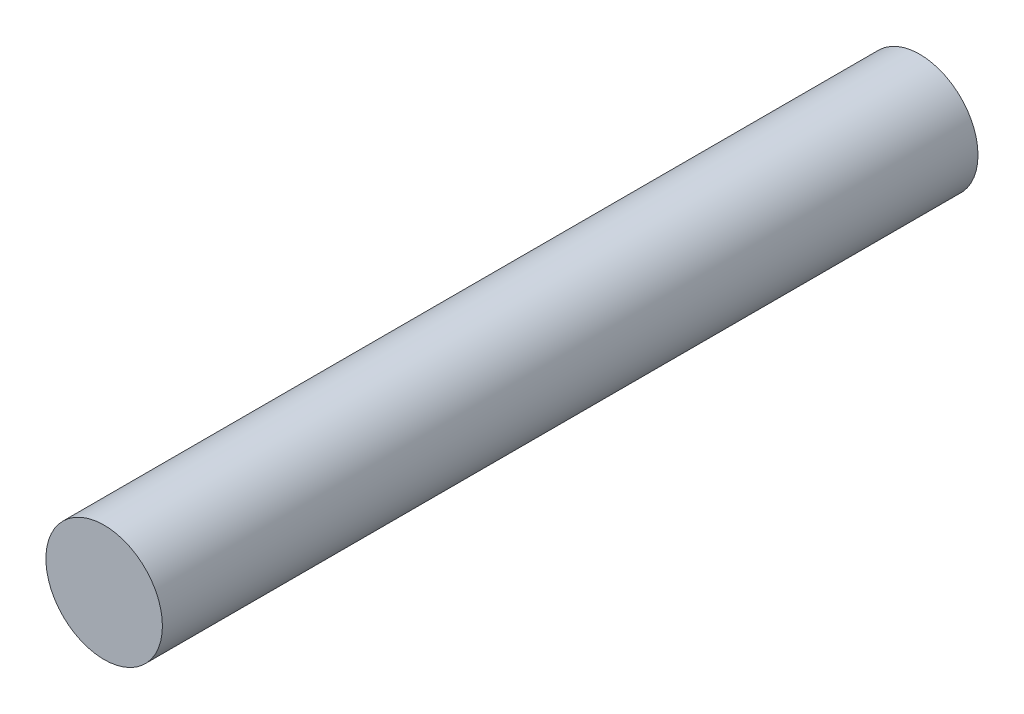
ISO-10303-21;
HEADER;
FILE_DESCRIPTION(('STEP AP214'),'2;1');
FILE_NAME('part.step','',(''),(''),'','','');
FILE_SCHEMA(('AUTOMOTIVE_DESIGN { 1 0 10303 214 1 1 1 1 }'));
ENDSEC;
DATA;
#1=APPLICATION_CONTEXT('core data for automotive mechanical design processes');
#2=APPLICATION_PROTOCOL_DEFINITION('international standard','automotive_design',2000,#1);
#3=PRODUCT_CONTEXT('',#1,'mechanical');
#4=PRODUCT('Part','Part','',(#3));
#5=PRODUCT_RELATED_PRODUCT_CATEGORY('part','',(#4));
#6=PRODUCT_DEFINITION_FORMATION('','',#4);
#7=PRODUCT_DEFINITION_CONTEXT('part definition',#1,'design');
#8=PRODUCT_DEFINITION('design','',#6,#7);
#9=PRODUCT_DEFINITION_SHAPE('','',#8);
#10=(LENGTH_UNIT() NAMED_UNIT(*) SI_UNIT(.MILLI.,.METRE.));
#11=(NAMED_UNIT(*) PLANE_ANGLE_UNIT() SI_UNIT($,.RADIAN.));
#12=(NAMED_UNIT(*) SI_UNIT($,.STERADIAN.) SOLID_ANGLE_UNIT());
#13=UNCERTAINTY_MEASURE_WITH_UNIT(LENGTH_MEASURE(1.E-05),#10,'distance_accuracy_value','');
#14=(GEOMETRIC_REPRESENTATION_CONTEXT(3) GLOBAL_UNCERTAINTY_ASSIGNED_CONTEXT((#13)) GLOBAL_UNIT_ASSIGNED_CONTEXT((#10,
#11,#12)) REPRESENTATION_CONTEXT('',''));
#15=CARTESIAN_POINT('',(0.,0.,0.));
#16=DIRECTION('',(0.,0.,1.));
#17=DIRECTION('',(1.,0.,0.));
#18=AXIS2_PLACEMENT_3D('',#15,#16,#17);
#19=CARTESIAN_POINT('',(0.,0.,44.45));
#20=DIRECTION('',(0.,0.,-1.));
#21=DIRECTION('',(-1.,0.,0.));
#22=AXIS2_PLACEMENT_3D('',#19,#20,#21);
#23=CYLINDRICAL_SURFACE('',#22,3.175);
#24=CARTESIAN_POINT('',(0.,0.,44.45));
#25=DIRECTION('',(0.,0.,1.));
#26=DIRECTION('',(1.,0.,0.));
#27=AXIS2_PLACEMENT_3D('',#24,#25,#26);
#28=CIRCLE('',#27,3.175);
#29=CARTESIAN_POINT('',(3.175,0.,44.45));
#30=VERTEX_POINT('',#29);
#31=EDGE_CURVE('E10',#30,#30,#28,.T.);
#32=ORIENTED_EDGE('',*,*,#31,.F.);
#33=EDGE_LOOP('',(#32));
#34=FACE_BOUND('',#33,.T.);
#35=CARTESIAN_POINT('',(0.,0.,0.));
#36=DIRECTION('',(0.,0.,1.));
#37=DIRECTION('',(1.,0.,0.));
#38=AXIS2_PLACEMENT_3D('',#35,#36,#37);
#39=CIRCLE('',#38,3.175);
#40=CARTESIAN_POINT('',(3.175,0.,0.));
#41=VERTEX_POINT('',#40);
#42=EDGE_CURVE('E40',#41,#41,#39,.T.);
#43=ORIENTED_EDGE('',*,*,#42,.T.);
#44=EDGE_LOOP('',(#43));
#45=FACE_BOUND('',#44,.T.);
#46=ADVANCED_FACE('F37',(#34,#45),#23,.T.);
#47=CARTESIAN_POINT('',(0.,0.,44.45));
#48=DIRECTION('',(0.,0.,1.));
#49=DIRECTION('',(1.,0.,0.));
#50=AXIS2_PLACEMENT_3D('',#47,#48,#49);
#51=PLANE('',#50);
#52=ORIENTED_EDGE('',*,*,#31,.T.);
#53=EDGE_LOOP('',(#52));
#54=FACE_BOUND('',#53,.T.);
#55=ADVANCED_FACE('F54',(#54),#51,.T.);
#56=CARTESIAN_POINT('',(0.,0.,0.));
#57=DIRECTION('',(0.,0.,1.));
#58=DIRECTION('',(1.,0.,0.));
#59=AXIS2_PLACEMENT_3D('',#56,#57,#58);
#60=PLANE('',#59);
#61=ORIENTED_EDGE('',*,*,#42,.F.);
#62=EDGE_LOOP('',(#61));
#63=FACE_BOUND('',#62,.T.);
#64=ADVANCED_FACE('F52',(#63),#60,.F.);
#65=CLOSED_SHELL('',(#46,#55,#64));
#66=MANIFOLD_SOLID_BREP('B2',#65);
#67=ADVANCED_BREP_SHAPE_REPRESENTATION('',(#18,#66),#14);
#68=SHAPE_DEFINITION_REPRESENTATION(#9,#67);
ENDSEC;
END-ISO-10303-21;
